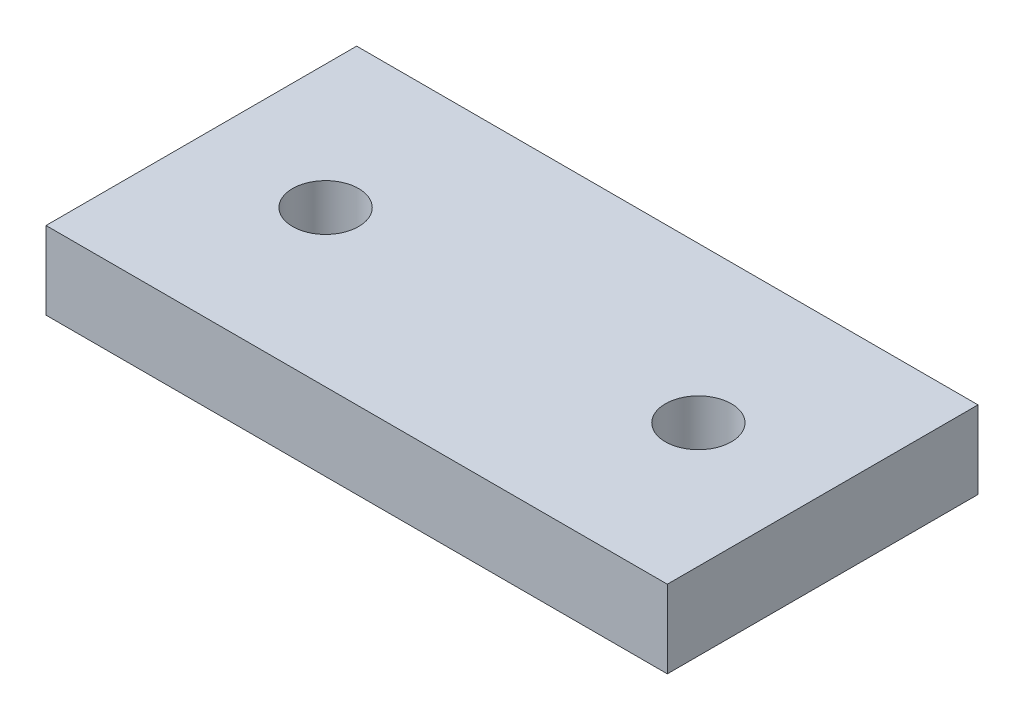
ISO-10303-21;
HEADER;
FILE_DESCRIPTION(('STEP AP214'),'2;1');
FILE_NAME('part.step','',(''),(''),'','','');
FILE_SCHEMA(('AUTOMOTIVE_DESIGN { 1 0 10303 214 1 1 1 1 }'));
ENDSEC;
DATA;
#1=APPLICATION_CONTEXT('core data for automotive mechanical design processes');
#2=APPLICATION_PROTOCOL_DEFINITION('international standard','automotive_design',2000,#1);
#3=PRODUCT_CONTEXT('',#1,'mechanical');
#4=PRODUCT('Part','Part','',(#3));
#5=PRODUCT_RELATED_PRODUCT_CATEGORY('part','',(#4));
#6=PRODUCT_DEFINITION_FORMATION('','',#4);
#7=PRODUCT_DEFINITION_CONTEXT('part definition',#1,'design');
#8=PRODUCT_DEFINITION('design','',#6,#7);
#9=PRODUCT_DEFINITION_SHAPE('','',#8);
#10=(LENGTH_UNIT() NAMED_UNIT(*) SI_UNIT(.MILLI.,.METRE.));
#11=(NAMED_UNIT(*) PLANE_ANGLE_UNIT() SI_UNIT($,.RADIAN.));
#12=(NAMED_UNIT(*) SI_UNIT($,.STERADIAN.) SOLID_ANGLE_UNIT());
#13=UNCERTAINTY_MEASURE_WITH_UNIT(LENGTH_MEASURE(1.E-05),#10,'distance_accuracy_value','');
#14=(GEOMETRIC_REPRESENTATION_CONTEXT(3) GLOBAL_UNCERTAINTY_ASSIGNED_CONTEXT((#13)) GLOBAL_UNIT_ASSIGNED_CONTEXT((#10,
#11,#12)) REPRESENTATION_CONTEXT('',''));
#15=CARTESIAN_POINT('',(0.,0.,0.));
#16=DIRECTION('',(0.,0.,1.));
#17=DIRECTION('',(1.,0.,0.));
#18=AXIS2_PLACEMENT_3D('',#15,#16,#17);
#19=CARTESIAN_POINT('',(0.,5.,0.));
#20=DIRECTION('',(0.,-1.,0.));
#21=DIRECTION('',(0.,0.,-1.));
#22=AXIS2_PLACEMENT_3D('',#19,#20,#21);
#23=PLANE('',#22);
#24=DIRECTION('',(0.,0.,-1.));
#25=VECTOR('',#24,1.);
#26=CARTESIAN_POINT('',(20.,5.,10.));
#27=LINE('',#26,#25);
#28=CARTESIAN_POINT('',(20.,5.,10.));
#29=VERTEX_POINT('',#28);
#30=CARTESIAN_POINT('',(20.,5.,-10.));
#31=VERTEX_POINT('',#30);
#32=EDGE_CURVE('E93',#29,#31,#27,.T.);
#33=ORIENTED_EDGE('',*,*,#32,.T.);
#34=DIRECTION('',(-1.,0.,0.));
#35=VECTOR('',#34,1.);
#36=CARTESIAN_POINT('',(-20.,5.,-10.));
#37=LINE('',#36,#35);
#38=CARTESIAN_POINT('',(-20.,5.,-10.));
#39=VERTEX_POINT('',#38);
#40=EDGE_CURVE('E88',#31,#39,#37,.T.);
#41=ORIENTED_EDGE('',*,*,#40,.T.);
#42=DIRECTION('',(0.,0.,1.));
#43=VECTOR('',#42,1.);
#44=CARTESIAN_POINT('',(-20.,5.,10.));
#45=LINE('',#44,#43);
#46=CARTESIAN_POINT('',(-20.,5.,10.));
#47=VERTEX_POINT('',#46);
#48=EDGE_CURVE('E91',#39,#47,#45,.T.);
#49=ORIENTED_EDGE('',*,*,#48,.T.);
#50=DIRECTION('',(1.,0.,0.));
#51=VECTOR('',#50,1.);
#52=CARTESIAN_POINT('',(-20.,5.,10.));
#53=LINE('',#52,#51);
#54=EDGE_CURVE('E58',#47,#29,#53,.T.);
#55=ORIENTED_EDGE('',*,*,#54,.T.);
#56=EDGE_LOOP('',(#33,#41,#49,#55));
#57=FACE_BOUND('',#56,.T.);
#58=CARTESIAN_POINT('',(-12.,5.,0.));
#59=DIRECTION('',(0.,1.,0.));
#60=DIRECTION('',(0.,0.,1.));
#61=AXIS2_PLACEMENT_3D('',#58,#59,#60);
#62=CIRCLE('',#61,2.125);
#63=CARTESIAN_POINT('',(-12.,5.,2.125));
#64=VERTEX_POINT('',#63);
#65=EDGE_CURVE('E108',#64,#64,#62,.T.);
#66=ORIENTED_EDGE('',*,*,#65,.F.);
#67=EDGE_LOOP('',(#66));
#68=FACE_BOUND('',#67,.T.);
#69=CARTESIAN_POINT('',(12.,5.,0.));
#70=DIRECTION('',(0.,1.,0.));
#71=DIRECTION('',(0.,0.,-1.));
#72=AXIS2_PLACEMENT_3D('',#69,#70,#71);
#73=CIRCLE('',#72,2.125);
#74=CARTESIAN_POINT('',(12.,5.,-2.12500000000001));
#75=VERTEX_POINT('',#74);
#76=EDGE_CURVE('E123',#75,#75,#73,.T.);
#77=ORIENTED_EDGE('',*,*,#76,.F.);
#78=EDGE_LOOP('',(#77));
#79=FACE_BOUND('',#78,.T.);
#80=ADVANCED_FACE('F41',(#57,#68,#79),#23,.F.);
#81=CARTESIAN_POINT('',(0.,0.,0.));
#82=DIRECTION('',(0.,-1.,0.));
#83=DIRECTION('',(0.,0.,-1.));
#84=AXIS2_PLACEMENT_3D('',#81,#82,#83);
#85=PLANE('',#84);
#86=CARTESIAN_POINT('',(-12.,0.,0.));
#87=DIRECTION('',(0.,1.,0.));
#88=DIRECTION('',(0.,0.,1.));
#89=AXIS2_PLACEMENT_3D('',#86,#87,#88);
#90=CIRCLE('',#89,2.125);
#91=CARTESIAN_POINT('',(-12.,0.,2.125));
#92=VERTEX_POINT('',#91);
#93=EDGE_CURVE('E120',#92,#92,#90,.T.);
#94=ORIENTED_EDGE('',*,*,#93,.T.);
#95=EDGE_LOOP('',(#94));
#96=FACE_BOUND('',#95,.T.);
#97=DIRECTION('',(0.,0.,-1.));
#98=VECTOR('',#97,1.);
#99=CARTESIAN_POINT('',(20.,0.,10.));
#100=LINE('',#99,#98);
#101=CARTESIAN_POINT('',(20.,0.,10.));
#102=VERTEX_POINT('',#101);
#103=CARTESIAN_POINT('',(20.,0.,-10.));
#104=VERTEX_POINT('',#103);
#105=EDGE_CURVE('E105',#102,#104,#100,.T.);
#106=ORIENTED_EDGE('',*,*,#105,.F.);
#107=DIRECTION('',(1.,0.,0.));
#108=VECTOR('',#107,1.);
#109=CARTESIAN_POINT('',(-20.,0.,10.));
#110=LINE('',#109,#108);
#111=CARTESIAN_POINT('',(-20.,0.,10.));
#112=VERTEX_POINT('',#111);
#113=EDGE_CURVE('E81',#112,#102,#110,.T.);
#114=ORIENTED_EDGE('',*,*,#113,.F.);
#115=DIRECTION('',(0.,0.,1.));
#116=VECTOR('',#115,1.);
#117=CARTESIAN_POINT('',(-20.,0.,10.));
#118=LINE('',#117,#116);
#119=CARTESIAN_POINT('',(-20.,0.,-10.));
#120=VERTEX_POINT('',#119);
#121=EDGE_CURVE('E75',#120,#112,#118,.T.);
#122=ORIENTED_EDGE('',*,*,#121,.F.);
#123=DIRECTION('',(-1.,0.,0.));
#124=VECTOR('',#123,1.);
#125=CARTESIAN_POINT('',(-20.,0.,-10.));
#126=LINE('',#125,#124);
#127=EDGE_CURVE('E97',#104,#120,#126,.T.);
#128=ORIENTED_EDGE('',*,*,#127,.F.);
#129=EDGE_LOOP('',(#106,#114,#122,#128));
#130=FACE_BOUND('',#129,.T.);
#131=CARTESIAN_POINT('',(12.,0.,0.));
#132=DIRECTION('',(0.,1.,0.));
#133=DIRECTION('',(0.,0.,-1.));
#134=AXIS2_PLACEMENT_3D('',#131,#132,#133);
#135=CIRCLE('',#134,2.125);
#136=CARTESIAN_POINT('',(12.,0.,-2.12500000000001));
#137=VERTEX_POINT('',#136);
#138=EDGE_CURVE('E126',#137,#137,#135,.T.);
#139=ORIENTED_EDGE('',*,*,#138,.T.);
#140=EDGE_LOOP('',(#139));
#141=FACE_BOUND('',#140,.T.);
#142=ADVANCED_FACE('F116',(#96,#130,#141),#85,.T.);
#143=CARTESIAN_POINT('',(20.,5.,10.));
#144=DIRECTION('',(-1.,0.,0.));
#145=DIRECTION('',(0.,0.,1.));
#146=AXIS2_PLACEMENT_3D('',#143,#144,#145);
#147=PLANE('',#146);
#148=ORIENTED_EDGE('',*,*,#105,.T.);
#149=DIRECTION('',(0.,-1.,0.));
#150=VECTOR('',#149,1.);
#151=CARTESIAN_POINT('',(20.,5.,-10.));
#152=LINE('',#151,#150);
#153=EDGE_CURVE('E11',#31,#104,#152,.T.);
#154=ORIENTED_EDGE('',*,*,#153,.F.);
#155=ORIENTED_EDGE('',*,*,#32,.F.);
#156=DIRECTION('',(0.,-1.,0.));
#157=VECTOR('',#156,1.);
#158=CARTESIAN_POINT('',(20.,5.,10.));
#159=LINE('',#158,#157);
#160=EDGE_CURVE('E101',#29,#102,#159,.T.);
#161=ORIENTED_EDGE('',*,*,#160,.T.);
#162=EDGE_LOOP('',(#148,#154,#155,#161));
#163=FACE_BOUND('',#162,.T.);
#164=ADVANCED_FACE('F43',(#163),#147,.F.);
#165=CARTESIAN_POINT('',(-20.,5.,-10.));
#166=DIRECTION('',(0.,0.,1.));
#167=DIRECTION('',(1.,0.,0.));
#168=AXIS2_PLACEMENT_3D('',#165,#166,#167);
#169=PLANE('',#168);
#170=ORIENTED_EDGE('',*,*,#127,.T.);
#171=DIRECTION('',(0.,-1.,0.));
#172=VECTOR('',#171,1.);
#173=CARTESIAN_POINT('',(-20.,5.,-10.));
#174=LINE('',#173,#172);
#175=EDGE_CURVE('E50',#39,#120,#174,.T.);
#176=ORIENTED_EDGE('',*,*,#175,.F.);
#177=ORIENTED_EDGE('',*,*,#40,.F.);
#178=ORIENTED_EDGE('',*,*,#153,.T.);
#179=EDGE_LOOP('',(#170,#176,#177,#178));
#180=FACE_BOUND('',#179,.T.);
#181=ADVANCED_FACE('F96',(#180),#169,.F.);
#182=CARTESIAN_POINT('',(-20.,5.,10.));
#183=DIRECTION('',(1.,0.,0.));
#184=DIRECTION('',(0.,0.,-1.));
#185=AXIS2_PLACEMENT_3D('',#182,#183,#184);
#186=PLANE('',#185);
#187=ORIENTED_EDGE('',*,*,#121,.T.);
#188=DIRECTION('',(0.,-1.,0.));
#189=VECTOR('',#188,1.);
#190=CARTESIAN_POINT('',(-20.,5.,10.));
#191=LINE('',#190,#189);
#192=EDGE_CURVE('E98',#47,#112,#191,.T.);
#193=ORIENTED_EDGE('',*,*,#192,.F.);
#194=ORIENTED_EDGE('',*,*,#48,.F.);
#195=ORIENTED_EDGE('',*,*,#175,.T.);
#196=EDGE_LOOP('',(#187,#193,#194,#195));
#197=FACE_BOUND('',#196,.T.);
#198=ADVANCED_FACE('F99',(#197),#186,.F.);
#199=CARTESIAN_POINT('',(-20.,5.,10.));
#200=DIRECTION('',(0.,0.,-1.));
#201=DIRECTION('',(-1.,0.,0.));
#202=AXIS2_PLACEMENT_3D('',#199,#200,#201);
#203=PLANE('',#202);
#204=ORIENTED_EDGE('',*,*,#113,.T.);
#205=ORIENTED_EDGE('',*,*,#160,.F.);
#206=ORIENTED_EDGE('',*,*,#54,.F.);
#207=ORIENTED_EDGE('',*,*,#192,.T.);
#208=EDGE_LOOP('',(#204,#205,#206,#207));
#209=FACE_BOUND('',#208,.T.);
#210=ADVANCED_FACE('F113',(#209),#203,.F.);
#211=CARTESIAN_POINT('',(-12.,5.,0.));
#212=DIRECTION('',(0.,-1.,0.));
#213=DIRECTION('',(0.,0.,-1.));
#214=AXIS2_PLACEMENT_3D('',#211,#212,#213);
#215=CYLINDRICAL_SURFACE('',#214,2.125);
#216=ORIENTED_EDGE('',*,*,#65,.T.);
#217=EDGE_LOOP('',(#216));
#218=FACE_BOUND('',#217,.T.);
#219=ORIENTED_EDGE('',*,*,#93,.F.);
#220=EDGE_LOOP('',(#219));
#221=FACE_BOUND('',#220,.T.);
#222=ADVANCED_FACE('F143',(#218,#221),#215,.F.);
#223=CARTESIAN_POINT('',(12.,5.,0.));
#224=DIRECTION('',(0.,-1.,0.));
#225=DIRECTION('',(0.,0.,-1.));
#226=AXIS2_PLACEMENT_3D('',#223,#224,#225);
#227=CYLINDRICAL_SURFACE('',#226,2.125);
#228=ORIENTED_EDGE('',*,*,#76,.T.);
#229=EDGE_LOOP('',(#228));
#230=FACE_BOUND('',#229,.T.);
#231=ORIENTED_EDGE('',*,*,#138,.F.);
#232=EDGE_LOOP('',(#231));
#233=FACE_BOUND('',#232,.T.);
#234=ADVANCED_FACE('F132',(#230,#233),#227,.F.);
#235=CLOSED_SHELL('',(#80,#142,#164,#181,#198,#210,#222,#234));
#236=MANIFOLD_SOLID_BREP('B2',#235);
#237=ADVANCED_BREP_SHAPE_REPRESENTATION('',(#18,#236),#14);
#238=SHAPE_DEFINITION_REPRESENTATION(#9,#237);
ENDSEC;
END-ISO-10303-21;
